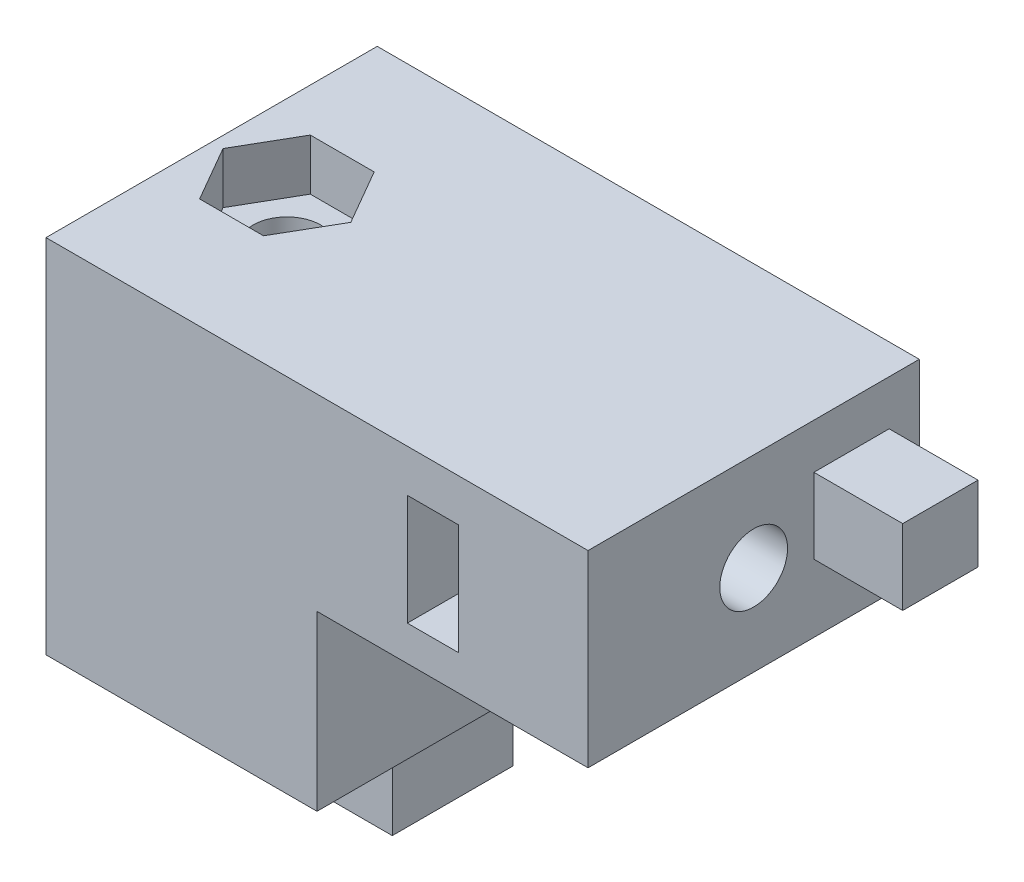
ISO-10303-21;
HEADER;
FILE_DESCRIPTION(('STEP AP214'),'2;1');
FILE_NAME('part.step','',(''),(''),'','','');
FILE_SCHEMA(('AUTOMOTIVE_DESIGN { 1 0 10303 214 1 1 1 1 }'));
ENDSEC;
DATA;
#1=APPLICATION_CONTEXT('core data for automotive mechanical design processes');
#2=APPLICATION_PROTOCOL_DEFINITION('international standard','automotive_design',2000,#1);
#3=PRODUCT_CONTEXT('',#1,'mechanical');
#4=PRODUCT('Part','Part','',(#3));
#5=PRODUCT_RELATED_PRODUCT_CATEGORY('part','',(#4));
#6=PRODUCT_DEFINITION_FORMATION('','',#4);
#7=PRODUCT_DEFINITION_CONTEXT('part definition',#1,'design');
#8=PRODUCT_DEFINITION('design','',#6,#7);
#9=PRODUCT_DEFINITION_SHAPE('','',#8);
#10=(LENGTH_UNIT() NAMED_UNIT(*) SI_UNIT(.MILLI.,.METRE.));
#11=(NAMED_UNIT(*) PLANE_ANGLE_UNIT() SI_UNIT($,.RADIAN.));
#12=(NAMED_UNIT(*) SI_UNIT($,.STERADIAN.) SOLID_ANGLE_UNIT());
#13=UNCERTAINTY_MEASURE_WITH_UNIT(LENGTH_MEASURE(1.E-05),#10,'distance_accuracy_value','');
#14=(GEOMETRIC_REPRESENTATION_CONTEXT(3) GLOBAL_UNCERTAINTY_ASSIGNED_CONTEXT((#13)) GLOBAL_UNIT_ASSIGNED_CONTEXT((#10,
#11,#12)) REPRESENTATION_CONTEXT('',''));
#15=CARTESIAN_POINT('',(0.,0.,0.));
#16=DIRECTION('',(0.,0.,1.));
#17=DIRECTION('',(1.,0.,0.));
#18=AXIS2_PLACEMENT_3D('',#15,#16,#17);
#19=CARTESIAN_POINT('',(0.,17.5,11.));
#20=DIRECTION('',(1.,0.,0.));
#21=DIRECTION('',(0.,0.,-1.));
#22=AXIS2_PLACEMENT_3D('',#19,#20,#21);
#23=CYLINDRICAL_SURFACE('',#22,2.25);
#24=CARTESIAN_POINT('',(23.9999999999924,17.5,11.));
#25=DIRECTION('',(-1.,0.,0.));
#26=DIRECTION('',(0.,0.,1.));
#27=AXIS2_PLACEMENT_3D('',#24,#25,#26);
#28=CIRCLE('',#27,2.25);
#29=CARTESIAN_POINT('',(23.9999999999924,17.5,13.25));
#30=VERTEX_POINT('',#29);
#31=EDGE_CURVE('E240',#30,#30,#28,.F.);
#32=ORIENTED_EDGE('',*,*,#31,.T.);
#33=EDGE_LOOP('',(#32));
#34=FACE_BOUND('',#33,.T.);
#35=CARTESIAN_POINT('',(5.,17.5,11.));
#36=DIRECTION('',(-0.707106781186547,0.707106781186547,0.));
#37=DIRECTION('',(0.707106781186547,0.707106781186547,0.));
#38=AXIS2_PLACEMENT_3D('',#35,#36,#37);
#39=ELLIPSE('',#38,3.18198051533946,2.25);
#40=CARTESIAN_POINT('',(5.,17.5,8.75));
#41=VERTEX_POINT('',#40);
#42=CARTESIAN_POINT('',(5.,17.5,13.25));
#43=VERTEX_POINT('',#42);
#44=EDGE_CURVE('E412',#41,#43,#39,.F.);
#45=ORIENTED_EDGE('',*,*,#44,.F.);
#46=CARTESIAN_POINT('',(5.,17.5,11.));
#47=DIRECTION('',(0.707106781186547,0.707106781186547,0.));
#48=DIRECTION('',(-0.707106781186547,0.707106781186547,0.));
#49=AXIS2_PLACEMENT_3D('',#46,#47,#48);
#50=ELLIPSE('',#49,3.18198051533946,2.25);
#51=EDGE_CURVE('E417',#43,#41,#50,.T.);
#52=ORIENTED_EDGE('',*,*,#51,.F.);
#53=EDGE_LOOP('',(#45,#52));
#54=FACE_BOUND('',#53,.T.);
#55=ADVANCED_FACE('F43',(#34,#54),#23,.F.);
#56=CARTESIAN_POINT('',(5.,-5.9,11.));
#57=DIRECTION('',(0.,1.,0.));
#58=DIRECTION('',(0.,0.,1.));
#59=AXIS2_PLACEMENT_3D('',#56,#57,#58);
#60=CYLINDRICAL_SURFACE('',#59,2.25);
#61=CARTESIAN_POINT('',(5.,20.6,11.));
#62=DIRECTION('',(0.,-1.,0.));
#63=DIRECTION('',(0.,0.,-1.));
#64=AXIS2_PLACEMENT_3D('',#61,#62,#63);
#65=CIRCLE('',#64,2.25);
#66=CARTESIAN_POINT('',(5.,20.6,8.75));
#67=VERTEX_POINT('',#66);
#68=EDGE_CURVE('E282',#67,#67,#65,.F.);
#69=ORIENTED_EDGE('',*,*,#68,.T.);
#70=EDGE_LOOP('',(#69));
#71=FACE_BOUND('',#70,.T.);
#72=ORIENTED_EDGE('',*,*,#44,.T.);
#73=CARTESIAN_POINT('',(5.,17.5,11.));
#74=DIRECTION('',(0.707106781186547,0.707106781186547,0.));
#75=DIRECTION('',(-0.707106781186547,0.707106781186547,0.));
#76=AXIS2_PLACEMENT_3D('',#73,#74,#75);
#77=ELLIPSE('',#76,3.18198051533946,2.25);
#78=EDGE_CURVE('E420',#43,#41,#77,.F.);
#79=ORIENTED_EDGE('',*,*,#78,.T.);
#80=EDGE_LOOP('',(#72,#79));
#81=FACE_BOUND('',#80,.T.);
#82=ADVANCED_FACE('F449',(#71,#81),#60,.F.);
#83=CARTESIAN_POINT('',(35.9999999999924,11.5,22.));
#84=DIRECTION('',(-1.,0.,0.));
#85=DIRECTION('',(0.,0.,1.));
#86=AXIS2_PLACEMENT_3D('',#83,#84,#85);
#87=PLANE('',#86);
#88=CARTESIAN_POINT('',(35.9999999999924,17.5,11.));
#89=DIRECTION('',(-1.,0.,0.));
#90=DIRECTION('',(0.,0.,1.));
#91=AXIS2_PLACEMENT_3D('',#88,#89,#90);
#92=CIRCLE('',#91,2.25);
#93=CARTESIAN_POINT('',(35.9999999999924,17.5,13.25));
#94=VERTEX_POINT('',#93);
#95=EDGE_CURVE('E296',#94,#94,#92,.T.);
#96=ORIENTED_EDGE('',*,*,#95,.T.);
#97=EDGE_LOOP('',(#96));
#98=FACE_BOUND('',#97,.T.);
#99=DIRECTION('',(0.,1.,0.));
#100=VECTOR('',#99,1.);
#101=CARTESIAN_POINT('',(35.9999999999924,11.5,0.));
#102=LINE('',#101,#100);
#103=CARTESIAN_POINT('',(35.9999999999924,11.5,0.));
#104=VERTEX_POINT('',#103);
#105=CARTESIAN_POINT('',(35.9999999999924,24.,0.));
#106=VERTEX_POINT('',#105);
#107=EDGE_CURVE('E392',#104,#106,#102,.T.);
#108=ORIENTED_EDGE('',*,*,#107,.T.);
#109=DIRECTION('',(0.,0.,-1.));
#110=VECTOR('',#109,1.);
#111=CARTESIAN_POINT('',(35.9999999999924,24.,22.));
#112=LINE('',#111,#110);
#113=CARTESIAN_POINT('',(35.9999999999924,24.,22.));
#114=VERTEX_POINT('',#113);
#115=EDGE_CURVE('E397',#114,#106,#112,.T.);
#116=ORIENTED_EDGE('',*,*,#115,.F.);
#117=DIRECTION('',(0.,1.,0.));
#118=VECTOR('',#117,1.);
#119=CARTESIAN_POINT('',(35.9999999999924,11.5,22.));
#120=LINE('',#119,#118);
#121=CARTESIAN_POINT('',(35.9999999999924,11.5,22.));
#122=VERTEX_POINT('',#121);
#123=EDGE_CURVE('E379',#122,#114,#120,.T.);
#124=ORIENTED_EDGE('',*,*,#123,.F.);
#125=DIRECTION('',(0.,0.,-1.));
#126=VECTOR('',#125,1.);
#127=CARTESIAN_POINT('',(35.9999999999924,11.5,22.));
#128=LINE('',#127,#126);
#129=EDGE_CURVE('E400',#122,#104,#128,.T.);
#130=ORIENTED_EDGE('',*,*,#129,.T.);
#131=EDGE_LOOP('',(#108,#116,#124,#130));
#132=FACE_BOUND('',#131,.T.);
#133=DIRECTION('',(0.,0.,-1.));
#134=VECTOR('',#133,1.);
#135=CARTESIAN_POINT('',(35.9999999999924,16.,7.));
#136=LINE('',#135,#134);
#137=CARTESIAN_POINT('',(35.9999999999924,16.,7.));
#138=VERTEX_POINT('',#137);
#139=CARTESIAN_POINT('',(35.9999999999924,16.,2.));
#140=VERTEX_POINT('',#139);
#141=EDGE_CURVE('E302',#138,#140,#136,.T.);
#142=ORIENTED_EDGE('',*,*,#141,.F.);
#143=DIRECTION('',(0.,-1.,0.));
#144=VECTOR('',#143,1.);
#145=CARTESIAN_POINT('',(35.9999999999924,21.,7.));
#146=LINE('',#145,#144);
#147=CARTESIAN_POINT('',(35.9999999999924,21.,7.));
#148=VERTEX_POINT('',#147);
#149=EDGE_CURVE('E307',#148,#138,#146,.T.);
#150=ORIENTED_EDGE('',*,*,#149,.F.);
#151=DIRECTION('',(0.,0.,1.));
#152=VECTOR('',#151,1.);
#153=CARTESIAN_POINT('',(35.9999999999924,21.,2.));
#154=LINE('',#153,#152);
#155=CARTESIAN_POINT('',(35.9999999999924,21.,2.));
#156=VERTEX_POINT('',#155);
#157=EDGE_CURVE('E319',#156,#148,#154,.T.);
#158=ORIENTED_EDGE('',*,*,#157,.F.);
#159=DIRECTION('',(0.,1.,0.));
#160=VECTOR('',#159,1.);
#161=CARTESIAN_POINT('',(35.9999999999924,16.,2.));
#162=LINE('',#161,#160);
#163=EDGE_CURVE('E316',#140,#156,#162,.T.);
#164=ORIENTED_EDGE('',*,*,#163,.F.);
#165=EDGE_LOOP('',(#142,#150,#158,#164));
#166=FACE_BOUND('',#165,.T.);
#167=ADVANCED_FACE('F458',(#98,#132,#166),#87,.F.);
#168=CARTESIAN_POINT('',(0.,24.,22.));
#169=DIRECTION('',(1.,0.,0.));
#170=DIRECTION('',(0.,0.,-1.));
#171=AXIS2_PLACEMENT_3D('',#168,#169,#170);
#172=PLANE('',#171);
#173=CARTESIAN_POINT('',(0.,17.5,11.));
#174=DIRECTION('',(1.,0.,0.));
#175=DIRECTION('',(0.,0.,-1.));
#176=AXIS2_PLACEMENT_3D('',#173,#174,#175);
#177=CIRCLE('',#176,2.25);
#178=CARTESIAN_POINT('',(0.,17.5,8.75));
#179=VERTEX_POINT('',#178);
#180=EDGE_CURVE('E293',#179,#179,#177,.T.);
#181=ORIENTED_EDGE('',*,*,#180,.T.);
#182=EDGE_LOOP('',(#181));
#183=FACE_BOUND('',#182,.T.);
#184=DIRECTION('',(0.,-1.,0.));
#185=VECTOR('',#184,1.);
#186=CARTESIAN_POINT('',(0.,24.,0.));
#187=LINE('',#186,#185);
#188=CARTESIAN_POINT('',(0.,24.,0.));
#189=VERTEX_POINT('',#188);
#190=CARTESIAN_POINT('',(0.,0.,0.));
#191=VERTEX_POINT('',#190);
#192=EDGE_CURVE('E363',#189,#191,#187,.T.);
#193=ORIENTED_EDGE('',*,*,#192,.T.);
#194=DIRECTION('',(0.,0.,-1.));
#195=VECTOR('',#194,1.);
#196=CARTESIAN_POINT('',(0.,0.,22.));
#197=LINE('',#196,#195);
#198=CARTESIAN_POINT('',(0.,0.,22.));
#199=VERTEX_POINT('',#198);
#200=EDGE_CURVE('E409',#199,#191,#197,.T.);
#201=ORIENTED_EDGE('',*,*,#200,.F.);
#202=DIRECTION('',(0.,-1.,0.));
#203=VECTOR('',#202,1.);
#204=CARTESIAN_POINT('',(0.,24.,22.));
#205=LINE('',#204,#203);
#206=CARTESIAN_POINT('',(0.,24.,22.));
#207=VERTEX_POINT('',#206);
#208=EDGE_CURVE('E369',#207,#199,#205,.T.);
#209=ORIENTED_EDGE('',*,*,#208,.F.);
#210=DIRECTION('',(0.,0.,-1.));
#211=VECTOR('',#210,1.);
#212=CARTESIAN_POINT('',(0.,24.,22.));
#213=LINE('',#212,#211);
#214=EDGE_CURVE('E383',#207,#189,#213,.T.);
#215=ORIENTED_EDGE('',*,*,#214,.T.);
#216=EDGE_LOOP('',(#193,#201,#209,#215));
#217=FACE_BOUND('',#216,.T.);
#218=ADVANCED_FACE('F45',(#183,#217),#172,.F.);
#219=CARTESIAN_POINT('',(0.,0.,22.));
#220=DIRECTION('',(0.,1.,0.));
#221=DIRECTION('',(0.,0.,1.));
#222=AXIS2_PLACEMENT_3D('',#219,#220,#221);
#223=PLANE('',#222);
#224=CARTESIAN_POINT('',(5.,0.,11.));
#225=DIRECTION('',(0.,1.,0.));
#226=DIRECTION('',(0.,0.,1.));
#227=AXIS2_PLACEMENT_3D('',#224,#225,#226);
#228=CIRCLE('',#227,2.25);
#229=CARTESIAN_POINT('',(5.,0.,13.25));
#230=VERTEX_POINT('',#229);
#231=EDGE_CURVE('E299',#230,#230,#228,.T.);
#232=ORIENTED_EDGE('',*,*,#231,.T.);
#233=EDGE_LOOP('',(#232));
#234=FACE_BOUND('',#233,.T.);
#235=DIRECTION('',(-1.,0.,0.));
#236=VECTOR('',#235,1.);
#237=CARTESIAN_POINT('',(10.,0.,7.));
#238=LINE('',#237,#236);
#239=CARTESIAN_POINT('',(16.,0.,7.));
#240=VERTEX_POINT('',#239);
#241=CARTESIAN_POINT('',(10.,0.,7.));
#242=VERTEX_POINT('',#241);
#243=EDGE_CURVE('E340',#240,#242,#238,.T.);
#244=ORIENTED_EDGE('',*,*,#243,.T.);
#245=DIRECTION('',(0.,0.,1.));
#246=VECTOR('',#245,1.);
#247=CARTESIAN_POINT('',(10.,0.,15.));
#248=LINE('',#247,#246);
#249=CARTESIAN_POINT('',(10.,0.,15.));
#250=VERTEX_POINT('',#249);
#251=EDGE_CURVE('E335',#242,#250,#248,.T.);
#252=ORIENTED_EDGE('',*,*,#251,.T.);
#253=DIRECTION('',(1.,0.,0.));
#254=VECTOR('',#253,1.);
#255=CARTESIAN_POINT('',(16.,0.,15.));
#256=LINE('',#255,#254);
#257=CARTESIAN_POINT('',(16.,0.,15.));
#258=VERTEX_POINT('',#257);
#259=EDGE_CURVE('E352',#250,#258,#256,.T.);
#260=ORIENTED_EDGE('',*,*,#259,.T.);
#261=DIRECTION('',(0.,0.,-1.));
#262=VECTOR('',#261,1.);
#263=CARTESIAN_POINT('',(16.,0.,7.));
#264=LINE('',#263,#262);
#265=EDGE_CURVE('E355',#258,#240,#264,.T.);
#266=ORIENTED_EDGE('',*,*,#265,.T.);
#267=EDGE_LOOP('',(#244,#252,#260,#266));
#268=FACE_BOUND('',#267,.T.);
#269=DIRECTION('',(1.,0.,0.));
#270=VECTOR('',#269,1.);
#271=CARTESIAN_POINT('',(0.,0.,0.));
#272=LINE('',#271,#270);
#273=CARTESIAN_POINT('',(18.,0.,0.));
#274=VERTEX_POINT('',#273);
#275=EDGE_CURVE('E386',#191,#274,#272,.T.);
#276=ORIENTED_EDGE('',*,*,#275,.T.);
#277=DIRECTION('',(0.,0.,-1.));
#278=VECTOR('',#277,1.);
#279=CARTESIAN_POINT('',(18.,0.,22.));
#280=LINE('',#279,#278);
#281=CARTESIAN_POINT('',(18.,0.,22.));
#282=VERTEX_POINT('',#281);
#283=EDGE_CURVE('E406',#282,#274,#280,.T.);
#284=ORIENTED_EDGE('',*,*,#283,.F.);
#285=DIRECTION('',(1.,0.,0.));
#286=VECTOR('',#285,1.);
#287=CARTESIAN_POINT('',(0.,0.,22.));
#288=LINE('',#287,#286);
#289=EDGE_CURVE('E372',#199,#282,#288,.T.);
#290=ORIENTED_EDGE('',*,*,#289,.F.);
#291=ORIENTED_EDGE('',*,*,#200,.T.);
#292=EDGE_LOOP('',(#276,#284,#290,#291));
#293=FACE_BOUND('',#292,.T.);
#294=ADVANCED_FACE('F542',(#234,#268,#293),#223,.F.);
#295=CARTESIAN_POINT('',(18.,0.,22.));
#296=DIRECTION('',(-1.,0.,0.));
#297=DIRECTION('',(0.,0.,1.));
#298=AXIS2_PLACEMENT_3D('',#295,#296,#297);
#299=PLANE('',#298);
#300=DIRECTION('',(0.,1.,0.));
#301=VECTOR('',#300,1.);
#302=CARTESIAN_POINT('',(18.,0.,0.));
#303=LINE('',#302,#301);
#304=CARTESIAN_POINT('',(18.,11.5,0.));
#305=VERTEX_POINT('',#304);
#306=EDGE_CURVE('E388',#274,#305,#303,.T.);
#307=ORIENTED_EDGE('',*,*,#306,.T.);
#308=DIRECTION('',(0.,0.,-1.));
#309=VECTOR('',#308,1.);
#310=CARTESIAN_POINT('',(18.,11.5,22.));
#311=LINE('',#310,#309);
#312=CARTESIAN_POINT('',(18.,11.5,22.));
#313=VERTEX_POINT('',#312);
#314=EDGE_CURVE('E403',#313,#305,#311,.T.);
#315=ORIENTED_EDGE('',*,*,#314,.F.);
#316=DIRECTION('',(0.,1.,0.));
#317=VECTOR('',#316,1.);
#318=CARTESIAN_POINT('',(18.,0.,22.));
#319=LINE('',#318,#317);
#320=EDGE_CURVE('E375',#282,#313,#319,.T.);
#321=ORIENTED_EDGE('',*,*,#320,.F.);
#322=ORIENTED_EDGE('',*,*,#283,.T.);
#323=EDGE_LOOP('',(#307,#315,#321,#322));
#324=FACE_BOUND('',#323,.T.);
#325=ADVANCED_FACE('F539',(#324),#299,.F.);
#326=CARTESIAN_POINT('',(18.,11.5,22.));
#327=DIRECTION('',(0.,1.,0.));
#328=DIRECTION('',(0.,0.,1.));
#329=AXIS2_PLACEMENT_3D('',#326,#327,#328);
#330=PLANE('',#329);
#331=DIRECTION('',(1.,0.,0.));
#332=VECTOR('',#331,1.);
#333=CARTESIAN_POINT('',(18.,11.5,0.));
#334=LINE('',#333,#332);
#335=EDGE_CURVE('E390',#305,#104,#334,.T.);
#336=ORIENTED_EDGE('',*,*,#335,.T.);
#337=ORIENTED_EDGE('',*,*,#129,.F.);
#338=DIRECTION('',(1.,0.,0.));
#339=VECTOR('',#338,1.);
#340=CARTESIAN_POINT('',(18.,11.5,22.));
#341=LINE('',#340,#339);
#342=EDGE_CURVE('E377',#313,#122,#341,.T.);
#343=ORIENTED_EDGE('',*,*,#342,.F.);
#344=ORIENTED_EDGE('',*,*,#314,.T.);
#345=EDGE_LOOP('',(#336,#337,#343,#344));
#346=FACE_BOUND('',#345,.T.);
#347=ADVANCED_FACE('F534',(#346),#330,.F.);
#348=CARTESIAN_POINT('',(35.9999999999924,24.,22.));
#349=DIRECTION('',(0.,-1.,0.));
#350=DIRECTION('',(0.,0.,-1.));
#351=AXIS2_PLACEMENT_3D('',#348,#349,#350);
#352=PLANE('',#351);
#353=DIRECTION('',(-1.,0.,0.));
#354=VECTOR('',#353,1.);
#355=CARTESIAN_POINT('',(2.87823776072812,24.,7.325));
#356=LINE('',#355,#354);
#357=CARTESIAN_POINT('',(7.12176223927187,24.,7.325));
#358=VERTEX_POINT('',#357);
#359=CARTESIAN_POINT('',(2.87823776072812,24.,7.325));
#360=VERTEX_POINT('',#359);
#361=EDGE_CURVE('E266',#358,#360,#356,.T.);
#362=ORIENTED_EDGE('',*,*,#361,.F.);
#363=DIRECTION('',(-0.5,0.,-0.866025403784439));
#364=VECTOR('',#363,1.);
#365=CARTESIAN_POINT('',(7.12176223927187,24.,7.325));
#366=LINE('',#365,#364);
#367=CARTESIAN_POINT('',(9.24352447854375,24.,11.));
#368=VERTEX_POINT('',#367);
#369=EDGE_CURVE('E244',#368,#358,#366,.T.);
#370=ORIENTED_EDGE('',*,*,#369,.F.);
#371=DIRECTION('',(0.5,0.,-0.866025403784439));
#372=VECTOR('',#371,1.);
#373=CARTESIAN_POINT('',(9.24352447854375,24.,11.));
#374=LINE('',#373,#372);
#375=CARTESIAN_POINT('',(7.12176223927187,24.,14.675));
#376=VERTEX_POINT('',#375);
#377=EDGE_CURVE('E249',#376,#368,#374,.T.);
#378=ORIENTED_EDGE('',*,*,#377,.F.);
#379=DIRECTION('',(1.,0.,0.));
#380=VECTOR('',#379,1.);
#381=CARTESIAN_POINT('',(7.12176223927187,24.,14.675));
#382=LINE('',#381,#380);
#383=CARTESIAN_POINT('',(2.87823776072813,24.,14.675));
#384=VERTEX_POINT('',#383);
#385=EDGE_CURVE('E275',#384,#376,#382,.T.);
#386=ORIENTED_EDGE('',*,*,#385,.F.);
#387=DIRECTION('',(0.5,0.,0.866025403784439));
#388=VECTOR('',#387,1.);
#389=CARTESIAN_POINT('',(2.87823776072813,24.,14.675));
#390=LINE('',#389,#388);
#391=CARTESIAN_POINT('',(0.756475521456251,24.,11.));
#392=VERTEX_POINT('',#391);
#393=EDGE_CURVE('E272',#392,#384,#390,.T.);
#394=ORIENTED_EDGE('',*,*,#393,.F.);
#395=DIRECTION('',(-0.5,0.,0.866025403784439));
#396=VECTOR('',#395,1.);
#397=CARTESIAN_POINT('',(0.756475521456251,24.,11.));
#398=LINE('',#397,#396);
#399=EDGE_CURVE('E269',#360,#392,#398,.T.);
#400=ORIENTED_EDGE('',*,*,#399,.F.);
#401=EDGE_LOOP('',(#362,#370,#378,#386,#394,#400));
#402=FACE_BOUND('',#401,.T.);
#403=DIRECTION('',(-1.,0.,0.));
#404=VECTOR('',#403,1.);
#405=CARTESIAN_POINT('',(35.9999999999924,24.,0.));
#406=LINE('',#405,#404);
#407=EDGE_CURVE('E373',#106,#189,#406,.T.);
#408=ORIENTED_EDGE('',*,*,#407,.T.);
#409=ORIENTED_EDGE('',*,*,#214,.F.);
#410=DIRECTION('',(-1.,0.,0.));
#411=VECTOR('',#410,1.);
#412=CARTESIAN_POINT('',(35.9999999999924,24.,22.));
#413=LINE('',#412,#411);
#414=EDGE_CURVE('E381',#114,#207,#413,.T.);
#415=ORIENTED_EDGE('',*,*,#414,.F.);
#416=ORIENTED_EDGE('',*,*,#115,.T.);
#417=EDGE_LOOP('',(#408,#409,#415,#416));
#418=FACE_BOUND('',#417,.T.);
#419=ADVANCED_FACE('F531',(#402,#418),#352,.F.);
#420=CARTESIAN_POINT('',(0.,0.,22.));
#421=DIRECTION('',(0.,0.,1.));
#422=DIRECTION('',(1.,0.,0.));
#423=AXIS2_PLACEMENT_3D('',#420,#421,#422);
#424=PLANE('',#423);
#425=DIRECTION('',(0.,-1.,0.));
#426=VECTOR('',#425,1.);
#427=CARTESIAN_POINT('',(23.9999999999924,21.175,22.));
#428=LINE('',#427,#426);
#429=CARTESIAN_POINT('',(23.9999999999924,21.175,22.));
#430=VERTEX_POINT('',#429);
#431=CARTESIAN_POINT('',(23.9999999999924,13.825,22.));
#432=VERTEX_POINT('',#431);
#433=EDGE_CURVE('E58',#430,#432,#428,.T.);
#434=ORIENTED_EDGE('',*,*,#433,.F.);
#435=DIRECTION('',(-1.,0.,0.));
#436=VECTOR('',#435,1.);
#437=CARTESIAN_POINT('',(27.3999999999924,21.175,22.));
#438=LINE('',#437,#436);
#439=CARTESIAN_POINT('',(27.3999999999924,21.175,22.));
#440=VERTEX_POINT('',#439);
#441=EDGE_CURVE('E229',#440,#430,#438,.T.);
#442=ORIENTED_EDGE('',*,*,#441,.F.);
#443=DIRECTION('',(0.,1.,0.));
#444=VECTOR('',#443,1.);
#445=CARTESIAN_POINT('',(27.3999999999924,13.825,22.));
#446=LINE('',#445,#444);
#447=CARTESIAN_POINT('',(27.3999999999924,13.825,22.));
#448=VERTEX_POINT('',#447);
#449=EDGE_CURVE('E213',#448,#440,#446,.T.);
#450=ORIENTED_EDGE('',*,*,#449,.F.);
#451=DIRECTION('',(1.,0.,0.));
#452=VECTOR('',#451,1.);
#453=CARTESIAN_POINT('',(23.9999999999924,13.825,22.));
#454=LINE('',#453,#452);
#455=EDGE_CURVE('E222',#432,#448,#454,.T.);
#456=ORIENTED_EDGE('',*,*,#455,.F.);
#457=EDGE_LOOP('',(#434,#442,#450,#456));
#458=FACE_BOUND('',#457,.T.);
#459=ORIENTED_EDGE('',*,*,#208,.T.);
#460=ORIENTED_EDGE('',*,*,#289,.T.);
#461=ORIENTED_EDGE('',*,*,#320,.T.);
#462=ORIENTED_EDGE('',*,*,#342,.T.);
#463=ORIENTED_EDGE('',*,*,#123,.T.);
#464=ORIENTED_EDGE('',*,*,#414,.T.);
#465=EDGE_LOOP('',(#459,#460,#461,#462,#463,#464));
#466=FACE_BOUND('',#465,.T.);
#467=ADVANCED_FACE('F226',(#458,#466),#424,.T.);
#468=CARTESIAN_POINT('',(0.,0.,0.));
#469=DIRECTION('',(0.,0.,1.));
#470=DIRECTION('',(1.,0.,0.));
#471=AXIS2_PLACEMENT_3D('',#468,#469,#470);
#472=PLANE('',#471);
#473=DIRECTION('',(-1.,0.,0.));
#474=VECTOR('',#473,1.);
#475=CARTESIAN_POINT('',(0.,21.175,0.));
#476=LINE('',#475,#474);
#477=CARTESIAN_POINT('',(27.3999999999924,21.175,0.));
#478=VERTEX_POINT('',#477);
#479=CARTESIAN_POINT('',(23.9999999999924,21.175,0.));
#480=VERTEX_POINT('',#479);
#481=EDGE_CURVE('E11',#478,#480,#476,.T.);
#482=ORIENTED_EDGE('',*,*,#481,.T.);
#483=DIRECTION('',(0.,-1.,0.));
#484=VECTOR('',#483,1.);
#485=CARTESIAN_POINT('',(23.9999999999924,0.,0.));
#486=LINE('',#485,#484);
#487=CARTESIAN_POINT('',(23.9999999999924,13.825,0.));
#488=VERTEX_POINT('',#487);
#489=EDGE_CURVE('E241',#480,#488,#486,.T.);
#490=ORIENTED_EDGE('',*,*,#489,.T.);
#491=DIRECTION('',(1.,0.,0.));
#492=VECTOR('',#491,1.);
#493=CARTESIAN_POINT('',(0.,13.825,0.));
#494=LINE('',#493,#492);
#495=CARTESIAN_POINT('',(27.3999999999924,13.825,0.));
#496=VERTEX_POINT('',#495);
#497=EDGE_CURVE('E51',#488,#496,#494,.T.);
#498=ORIENTED_EDGE('',*,*,#497,.T.);
#499=DIRECTION('',(0.,1.,0.));
#500=VECTOR('',#499,1.);
#501=CARTESIAN_POINT('',(27.3999999999924,0.,0.));
#502=LINE('',#501,#500);
#503=EDGE_CURVE('E216',#496,#478,#502,.T.);
#504=ORIENTED_EDGE('',*,*,#503,.T.);
#505=EDGE_LOOP('',(#482,#490,#498,#504));
#506=FACE_BOUND('',#505,.T.);
#507=ORIENTED_EDGE('',*,*,#192,.F.);
#508=ORIENTED_EDGE('',*,*,#407,.F.);
#509=ORIENTED_EDGE('',*,*,#107,.F.);
#510=ORIENTED_EDGE('',*,*,#335,.F.);
#511=ORIENTED_EDGE('',*,*,#306,.F.);
#512=ORIENTED_EDGE('',*,*,#275,.F.);
#513=EDGE_LOOP('',(#507,#508,#509,#510,#511,#512));
#514=FACE_BOUND('',#513,.T.);
#515=ADVANCED_FACE('F429',(#506,#514),#472,.F.);
#516=CARTESIAN_POINT('',(10.,-5.9,15.));
#517=DIRECTION('',(-1.,0.,0.));
#518=DIRECTION('',(0.,0.,1.));
#519=AXIS2_PLACEMENT_3D('',#516,#517,#518);
#520=PLANE('',#519);
#521=ORIENTED_EDGE('',*,*,#251,.F.);
#522=DIRECTION('',(0.,1.,0.));
#523=VECTOR('',#522,1.);
#524=CARTESIAN_POINT('',(10.,-5.9,7.));
#525=LINE('',#524,#523);
#526=CARTESIAN_POINT('',(10.,-5.9,7.));
#527=VERTEX_POINT('',#526);
#528=EDGE_CURVE('E360',#527,#242,#525,.T.);
#529=ORIENTED_EDGE('',*,*,#528,.F.);
#530=DIRECTION('',(0.,0.,1.));
#531=VECTOR('',#530,1.);
#532=CARTESIAN_POINT('',(10.,-5.9,15.));
#533=LINE('',#532,#531);
#534=CARTESIAN_POINT('',(10.,-5.9,15.));
#535=VERTEX_POINT('',#534);
#536=EDGE_CURVE('E336',#527,#535,#533,.T.);
#537=ORIENTED_EDGE('',*,*,#536,.T.);
#538=DIRECTION('',(0.,1.,0.));
#539=VECTOR('',#538,1.);
#540=CARTESIAN_POINT('',(10.,-5.9,15.));
#541=LINE('',#540,#539);
#542=EDGE_CURVE('E349',#535,#250,#541,.T.);
#543=ORIENTED_EDGE('',*,*,#542,.T.);
#544=EDGE_LOOP('',(#521,#529,#537,#543));
#545=FACE_BOUND('',#544,.T.);
#546=ADVANCED_FACE('F519',(#545),#520,.T.);
#547=CARTESIAN_POINT('',(10.,-5.9,7.));
#548=DIRECTION('',(0.,0.,-1.));
#549=DIRECTION('',(-1.,0.,0.));
#550=AXIS2_PLACEMENT_3D('',#547,#548,#549);
#551=PLANE('',#550);
#552=ORIENTED_EDGE('',*,*,#243,.F.);
#553=DIRECTION('',(0.,1.,0.));
#554=VECTOR('',#553,1.);
#555=CARTESIAN_POINT('',(16.,-5.9,7.));
#556=LINE('',#555,#554);
#557=CARTESIAN_POINT('',(16.,-5.9,7.));
#558=VERTEX_POINT('',#557);
#559=EDGE_CURVE('E364',#558,#240,#556,.T.);
#560=ORIENTED_EDGE('',*,*,#559,.F.);
#561=DIRECTION('',(-1.,0.,0.));
#562=VECTOR('',#561,1.);
#563=CARTESIAN_POINT('',(10.,-5.9,7.));
#564=LINE('',#563,#562);
#565=EDGE_CURVE('E346',#558,#527,#564,.T.);
#566=ORIENTED_EDGE('',*,*,#565,.T.);
#567=ORIENTED_EDGE('',*,*,#528,.T.);
#568=EDGE_LOOP('',(#552,#560,#566,#567));
#569=FACE_BOUND('',#568,.T.);
#570=ADVANCED_FACE('F515',(#569),#551,.T.);
#571=CARTESIAN_POINT('',(16.,-5.9,7.));
#572=DIRECTION('',(1.,0.,0.));
#573=DIRECTION('',(0.,0.,-1.));
#574=AXIS2_PLACEMENT_3D('',#571,#572,#573);
#575=PLANE('',#574);
#576=ORIENTED_EDGE('',*,*,#265,.F.);
#577=DIRECTION('',(0.,1.,0.));
#578=VECTOR('',#577,1.);
#579=CARTESIAN_POINT('',(16.,-5.9,15.));
#580=LINE('',#579,#578);
#581=CARTESIAN_POINT('',(16.,-5.9,15.));
#582=VERTEX_POINT('',#581);
#583=EDGE_CURVE('E366',#582,#258,#580,.T.);
#584=ORIENTED_EDGE('',*,*,#583,.F.);
#585=DIRECTION('',(0.,0.,-1.));
#586=VECTOR('',#585,1.);
#587=CARTESIAN_POINT('',(16.,-5.9,7.));
#588=LINE('',#587,#586);
#589=EDGE_CURVE('E343',#582,#558,#588,.T.);
#590=ORIENTED_EDGE('',*,*,#589,.T.);
#591=ORIENTED_EDGE('',*,*,#559,.T.);
#592=EDGE_LOOP('',(#576,#584,#590,#591));
#593=FACE_BOUND('',#592,.T.);
#594=ADVANCED_FACE('F518',(#593),#575,.T.);
#595=CARTESIAN_POINT('',(16.,-5.9,15.));
#596=DIRECTION('',(0.,0.,1.));
#597=DIRECTION('',(1.,0.,0.));
#598=AXIS2_PLACEMENT_3D('',#595,#596,#597);
#599=PLANE('',#598);
#600=ORIENTED_EDGE('',*,*,#259,.F.);
#601=ORIENTED_EDGE('',*,*,#542,.F.);
#602=DIRECTION('',(1.,0.,0.));
#603=VECTOR('',#602,1.);
#604=CARTESIAN_POINT('',(16.,-5.9,15.));
#605=LINE('',#604,#603);
#606=EDGE_CURVE('E339',#535,#582,#605,.T.);
#607=ORIENTED_EDGE('',*,*,#606,.T.);
#608=ORIENTED_EDGE('',*,*,#583,.T.);
#609=EDGE_LOOP('',(#600,#601,#607,#608));
#610=FACE_BOUND('',#609,.T.);
#611=ADVANCED_FACE('F513',(#610),#599,.T.);
#612=CARTESIAN_POINT('',(0.,-5.9,0.));
#613=DIRECTION('',(0.,-1.,0.));
#614=DIRECTION('',(0.,0.,-1.));
#615=AXIS2_PLACEMENT_3D('',#612,#613,#614);
#616=PLANE('',#615);
#617=ORIENTED_EDGE('',*,*,#536,.F.);
#618=ORIENTED_EDGE('',*,*,#565,.F.);
#619=ORIENTED_EDGE('',*,*,#589,.F.);
#620=ORIENTED_EDGE('',*,*,#606,.F.);
#621=EDGE_LOOP('',(#617,#618,#619,#620));
#622=FACE_BOUND('',#621,.T.);
#623=ADVANCED_FACE('F507',(#622),#616,.T.);
#624=CARTESIAN_POINT('',(41.8999999999924,16.,7.));
#625=DIRECTION('',(0.,1.,0.));
#626=DIRECTION('',(0.,0.,1.));
#627=AXIS2_PLACEMENT_3D('',#624,#625,#626);
#628=PLANE('',#627);
#629=ORIENTED_EDGE('',*,*,#141,.T.);
#630=DIRECTION('',(-1.,0.,0.));
#631=VECTOR('',#630,1.);
#632=CARTESIAN_POINT('',(41.8999999999924,16.,2.));
#633=LINE('',#632,#631);
#634=CARTESIAN_POINT('',(41.8999999999924,16.,2.));
#635=VERTEX_POINT('',#634);
#636=EDGE_CURVE('E332',#635,#140,#633,.T.);
#637=ORIENTED_EDGE('',*,*,#636,.F.);
#638=DIRECTION('',(0.,0.,-1.));
#639=VECTOR('',#638,1.);
#640=CARTESIAN_POINT('',(41.8999999999924,16.,7.));
#641=LINE('',#640,#639);
#642=CARTESIAN_POINT('',(41.8999999999924,16.,7.));
#643=VERTEX_POINT('',#642);
#644=EDGE_CURVE('E303',#643,#635,#641,.T.);
#645=ORIENTED_EDGE('',*,*,#644,.F.);
#646=DIRECTION('',(-1.,0.,0.));
#647=VECTOR('',#646,1.);
#648=CARTESIAN_POINT('',(41.8999999999924,16.,7.));
#649=LINE('',#648,#647);
#650=EDGE_CURVE('E313',#643,#138,#649,.T.);
#651=ORIENTED_EDGE('',*,*,#650,.T.);
#652=EDGE_LOOP('',(#629,#637,#645,#651));
#653=FACE_BOUND('',#652,.T.);
#654=ADVANCED_FACE('F492',(#653),#628,.F.);
#655=CARTESIAN_POINT('',(41.8999999999924,16.,2.));
#656=DIRECTION('',(0.,0.,1.));
#657=DIRECTION('',(1.,0.,0.));
#658=AXIS2_PLACEMENT_3D('',#655,#656,#657);
#659=PLANE('',#658);
#660=ORIENTED_EDGE('',*,*,#163,.T.);
#661=DIRECTION('',(-1.,0.,0.));
#662=VECTOR('',#661,1.);
#663=CARTESIAN_POINT('',(41.8999999999924,21.,2.));
#664=LINE('',#663,#662);
#665=CARTESIAN_POINT('',(41.8999999999924,21.,2.));
#666=VERTEX_POINT('',#665);
#667=EDGE_CURVE('E329',#666,#156,#664,.T.);
#668=ORIENTED_EDGE('',*,*,#667,.F.);
#669=DIRECTION('',(0.,1.,0.));
#670=VECTOR('',#669,1.);
#671=CARTESIAN_POINT('',(41.8999999999924,16.,2.));
#672=LINE('',#671,#670);
#673=EDGE_CURVE('E306',#635,#666,#672,.T.);
#674=ORIENTED_EDGE('',*,*,#673,.F.);
#675=ORIENTED_EDGE('',*,*,#636,.T.);
#676=EDGE_LOOP('',(#660,#668,#674,#675));
#677=FACE_BOUND('',#676,.T.);
#678=ADVANCED_FACE('F499',(#677),#659,.F.);
#679=CARTESIAN_POINT('',(41.8999999999924,21.,2.));
#680=DIRECTION('',(0.,-1.,0.));
#681=DIRECTION('',(0.,0.,-1.));
#682=AXIS2_PLACEMENT_3D('',#679,#680,#681);
#683=PLANE('',#682);
#684=ORIENTED_EDGE('',*,*,#157,.T.);
#685=DIRECTION('',(-1.,0.,0.));
#686=VECTOR('',#685,1.);
#687=CARTESIAN_POINT('',(41.8999999999924,21.,7.));
#688=LINE('',#687,#686);
#689=CARTESIAN_POINT('',(41.8999999999924,21.,7.));
#690=VERTEX_POINT('',#689);
#691=EDGE_CURVE('E326',#690,#148,#688,.T.);
#692=ORIENTED_EDGE('',*,*,#691,.F.);
#693=DIRECTION('',(0.,0.,1.));
#694=VECTOR('',#693,1.);
#695=CARTESIAN_POINT('',(41.8999999999924,21.,2.));
#696=LINE('',#695,#694);
#697=EDGE_CURVE('E309',#666,#690,#696,.T.);
#698=ORIENTED_EDGE('',*,*,#697,.F.);
#699=ORIENTED_EDGE('',*,*,#667,.T.);
#700=EDGE_LOOP('',(#684,#692,#698,#699));
#701=FACE_BOUND('',#700,.T.);
#702=ADVANCED_FACE('F497',(#701),#683,.F.);
#703=CARTESIAN_POINT('',(41.8999999999924,21.,7.));
#704=DIRECTION('',(0.,0.,-1.));
#705=DIRECTION('',(-1.,0.,0.));
#706=AXIS2_PLACEMENT_3D('',#703,#704,#705);
#707=PLANE('',#706);
#708=ORIENTED_EDGE('',*,*,#149,.T.);
#709=ORIENTED_EDGE('',*,*,#650,.F.);
#710=DIRECTION('',(0.,-1.,0.));
#711=VECTOR('',#710,1.);
#712=CARTESIAN_POINT('',(41.8999999999924,21.,7.));
#713=LINE('',#712,#711);
#714=EDGE_CURVE('E311',#690,#643,#713,.T.);
#715=ORIENTED_EDGE('',*,*,#714,.F.);
#716=ORIENTED_EDGE('',*,*,#691,.T.);
#717=EDGE_LOOP('',(#708,#709,#715,#716));
#718=FACE_BOUND('',#717,.T.);
#719=ADVANCED_FACE('F488',(#718),#707,.F.);
#720=CARTESIAN_POINT('',(41.8999999999924,0.,0.));
#721=DIRECTION('',(1.,0.,0.));
#722=DIRECTION('',(0.,0.,-1.));
#723=AXIS2_PLACEMENT_3D('',#720,#721,#722);
#724=PLANE('',#723);
#725=ORIENTED_EDGE('',*,*,#644,.T.);
#726=ORIENTED_EDGE('',*,*,#673,.T.);
#727=ORIENTED_EDGE('',*,*,#697,.T.);
#728=ORIENTED_EDGE('',*,*,#714,.T.);
#729=EDGE_LOOP('',(#725,#726,#727,#728));
#730=FACE_BOUND('',#729,.T.);
#731=ADVANCED_FACE('F472',(#730),#724,.T.);
#732=CARTESIAN_POINT('',(5.,17.5,11.));
#733=DIRECTION('',(-0.707106781186547,0.707106781186547,0.));
#734=DIRECTION('',(0.707106781186547,0.707106781186547,0.));
#735=AXIS2_PLACEMENT_3D('',#732,#733,#734);
#736=ELLIPSE('',#735,3.18198051533946,2.25);
#737=EDGE_CURVE('E414',#41,#43,#736,.T.);
#738=ORIENTED_EDGE('',*,*,#737,.T.);
#739=ORIENTED_EDGE('',*,*,#51,.T.);
#740=EDGE_LOOP('',(#738,#739));
#741=FACE_BOUND('',#740,.T.);
#742=ORIENTED_EDGE('',*,*,#231,.F.);
#743=EDGE_LOOP('',(#742));
#744=FACE_BOUND('',#743,.T.);
#745=ADVANCED_FACE('F461',(#741,#744),#60,.F.);
#746=CARTESIAN_POINT('',(27.3999999999924,17.5,11.));
#747=DIRECTION('',(1.,0.,0.));
#748=DIRECTION('',(0.,0.,-1.));
#749=AXIS2_PLACEMENT_3D('',#746,#747,#748);
#750=CIRCLE('',#749,2.25);
#751=CARTESIAN_POINT('',(27.3999999999924,17.5,8.75));
#752=VERTEX_POINT('',#751);
#753=EDGE_CURVE('E236',#752,#752,#750,.F.);
#754=ORIENTED_EDGE('',*,*,#753,.T.);
#755=EDGE_LOOP('',(#754));
#756=FACE_BOUND('',#755,.T.);
#757=ORIENTED_EDGE('',*,*,#95,.F.);
#758=EDGE_LOOP('',(#757));
#759=FACE_BOUND('',#758,.T.);
#760=ADVANCED_FACE('F453',(#756,#759),#23,.F.);
#761=ORIENTED_EDGE('',*,*,#180,.F.);
#762=EDGE_LOOP('',(#761));
#763=FACE_BOUND('',#762,.T.);
#764=ORIENTED_EDGE('',*,*,#737,.F.);
#765=ORIENTED_EDGE('',*,*,#78,.F.);
#766=EDGE_LOOP('',(#764,#765));
#767=FACE_BOUND('',#766,.T.);
#768=ADVANCED_FACE('F452',(#763,#767),#23,.F.);
#769=CARTESIAN_POINT('',(0.,20.6,0.));
#770=DIRECTION('',(0.,-1.,0.));
#771=DIRECTION('',(0.,0.,-1.));
#772=AXIS2_PLACEMENT_3D('',#769,#770,#771);
#773=PLANE('',#772);
#774=DIRECTION('',(-0.5,0.,-0.866025403784439));
#775=VECTOR('',#774,1.);
#776=CARTESIAN_POINT('',(7.12176223927187,20.6,7.325));
#777=LINE('',#776,#775);
#778=CARTESIAN_POINT('',(9.24352447854375,20.6,11.));
#779=VERTEX_POINT('',#778);
#780=CARTESIAN_POINT('',(7.12176223927187,20.6,7.325));
#781=VERTEX_POINT('',#780);
#782=EDGE_CURVE('E245',#779,#781,#777,.T.);
#783=ORIENTED_EDGE('',*,*,#782,.T.);
#784=DIRECTION('',(-1.,0.,0.));
#785=VECTOR('',#784,1.);
#786=CARTESIAN_POINT('',(2.87823776072812,20.6,7.325));
#787=LINE('',#786,#785);
#788=CARTESIAN_POINT('',(2.87823776072812,20.6,7.325));
#789=VERTEX_POINT('',#788);
#790=EDGE_CURVE('E248',#781,#789,#787,.T.);
#791=ORIENTED_EDGE('',*,*,#790,.T.);
#792=DIRECTION('',(-0.5,0.,0.866025403784439));
#793=VECTOR('',#792,1.);
#794=CARTESIAN_POINT('',(0.756475521456251,20.6,11.));
#795=LINE('',#794,#793);
#796=CARTESIAN_POINT('',(0.756475521456251,20.6,11.));
#797=VERTEX_POINT('',#796);
#798=EDGE_CURVE('E252',#789,#797,#795,.T.);
#799=ORIENTED_EDGE('',*,*,#798,.T.);
#800=DIRECTION('',(0.5,0.,0.866025403784439));
#801=VECTOR('',#800,1.);
#802=CARTESIAN_POINT('',(2.87823776072813,20.6,14.675));
#803=LINE('',#802,#801);
#804=CARTESIAN_POINT('',(2.87823776072813,20.6,14.675));
#805=VERTEX_POINT('',#804);
#806=EDGE_CURVE('E255',#797,#805,#803,.T.);
#807=ORIENTED_EDGE('',*,*,#806,.T.);
#808=DIRECTION('',(1.,0.,0.));
#809=VECTOR('',#808,1.);
#810=CARTESIAN_POINT('',(7.12176223927187,20.6,14.675));
#811=LINE('',#810,#809);
#812=CARTESIAN_POINT('',(7.12176223927187,20.6,14.675));
#813=VERTEX_POINT('',#812);
#814=EDGE_CURVE('E258',#805,#813,#811,.T.);
#815=ORIENTED_EDGE('',*,*,#814,.T.);
#816=DIRECTION('',(0.5,0.,-0.866025403784439));
#817=VECTOR('',#816,1.);
#818=CARTESIAN_POINT('',(9.24352447854375,20.6,11.));
#819=LINE('',#818,#817);
#820=EDGE_CURVE('E261',#813,#779,#819,.T.);
#821=ORIENTED_EDGE('',*,*,#820,.T.);
#822=EDGE_LOOP('',(#783,#791,#799,#807,#815,#821));
#823=FACE_BOUND('',#822,.T.);
#824=ORIENTED_EDGE('',*,*,#68,.F.);
#825=EDGE_LOOP('',(#824));
#826=FACE_BOUND('',#825,.T.);
#827=ADVANCED_FACE('F465',(#823,#826),#773,.F.);
#828=CARTESIAN_POINT('',(7.12176223927187,20.6,7.325));
#829=DIRECTION('',(0.866025403784439,0.,-0.5));
#830=DIRECTION('',(-0.5,0.,-0.866025403784439));
#831=AXIS2_PLACEMENT_3D('',#828,#829,#830);
#832=PLANE('',#831);
#833=ORIENTED_EDGE('',*,*,#369,.T.);
#834=DIRECTION('',(0.,1.,0.));
#835=VECTOR('',#834,1.);
#836=CARTESIAN_POINT('',(7.12176223927187,20.6,7.325));
#837=LINE('',#836,#835);
#838=EDGE_CURVE('E264',#781,#358,#837,.T.);
#839=ORIENTED_EDGE('',*,*,#838,.F.);
#840=ORIENTED_EDGE('',*,*,#782,.F.);
#841=DIRECTION('',(0.,1.,0.));
#842=VECTOR('',#841,1.);
#843=CARTESIAN_POINT('',(9.24352447854375,20.6,11.));
#844=LINE('',#843,#842);
#845=EDGE_CURVE('E280',#779,#368,#844,.T.);
#846=ORIENTED_EDGE('',*,*,#845,.T.);
#847=EDGE_LOOP('',(#833,#839,#840,#846));
#848=FACE_BOUND('',#847,.T.);
#849=ADVANCED_FACE('F618',(#848),#832,.F.);
#850=CARTESIAN_POINT('',(9.24352447854375,20.6,11.));
#851=DIRECTION('',(0.866025403784439,0.,0.5));
#852=DIRECTION('',(0.5,0.,-0.866025403784439));
#853=AXIS2_PLACEMENT_3D('',#850,#851,#852);
#854=PLANE('',#853);
#855=ORIENTED_EDGE('',*,*,#377,.T.);
#856=ORIENTED_EDGE('',*,*,#845,.F.);
#857=ORIENTED_EDGE('',*,*,#820,.F.);
#858=DIRECTION('',(0.,1.,0.));
#859=VECTOR('',#858,1.);
#860=CARTESIAN_POINT('',(7.12176223927187,20.6,14.675));
#861=LINE('',#860,#859);
#862=EDGE_CURVE('E283',#813,#376,#861,.T.);
#863=ORIENTED_EDGE('',*,*,#862,.T.);
#864=EDGE_LOOP('',(#855,#856,#857,#863));
#865=FACE_BOUND('',#864,.T.);
#866=ADVANCED_FACE('F627',(#865),#854,.F.);
#867=CARTESIAN_POINT('',(7.12176223927187,20.6,14.675));
#868=DIRECTION('',(0.,0.,1.));
#869=DIRECTION('',(1.,0.,0.));
#870=AXIS2_PLACEMENT_3D('',#867,#868,#869);
#871=PLANE('',#870);
#872=ORIENTED_EDGE('',*,*,#385,.T.);
#873=ORIENTED_EDGE('',*,*,#862,.F.);
#874=ORIENTED_EDGE('',*,*,#814,.F.);
#875=DIRECTION('',(0.,1.,0.));
#876=VECTOR('',#875,1.);
#877=CARTESIAN_POINT('',(2.87823776072813,20.6,14.675));
#878=LINE('',#877,#876);
#879=EDGE_CURVE('E285',#805,#384,#878,.T.);
#880=ORIENTED_EDGE('',*,*,#879,.T.);
#881=EDGE_LOOP('',(#872,#873,#874,#880));
#882=FACE_BOUND('',#881,.T.);
#883=ADVANCED_FACE('F635',(#882),#871,.F.);
#884=CARTESIAN_POINT('',(2.87823776072813,20.6,14.675));
#885=DIRECTION('',(-0.866025403784439,0.,0.5));
#886=DIRECTION('',(0.5,0.,0.866025403784439));
#887=AXIS2_PLACEMENT_3D('',#884,#885,#886);
#888=PLANE('',#887);
#889=ORIENTED_EDGE('',*,*,#393,.T.);
#890=ORIENTED_EDGE('',*,*,#879,.F.);
#891=ORIENTED_EDGE('',*,*,#806,.F.);
#892=DIRECTION('',(0.,1.,0.));
#893=VECTOR('',#892,1.);
#894=CARTESIAN_POINT('',(0.756475521456251,20.6,11.));
#895=LINE('',#894,#893);
#896=EDGE_CURVE('E287',#797,#392,#895,.T.);
#897=ORIENTED_EDGE('',*,*,#896,.T.);
#898=EDGE_LOOP('',(#889,#890,#891,#897));
#899=FACE_BOUND('',#898,.T.);
#900=ADVANCED_FACE('F644',(#899),#888,.F.);
#901=CARTESIAN_POINT('',(0.756475521456251,20.6,11.));
#902=DIRECTION('',(-0.866025403784439,0.,-0.5));
#903=DIRECTION('',(-0.5,0.,0.866025403784439));
#904=AXIS2_PLACEMENT_3D('',#901,#902,#903);
#905=PLANE('',#904);
#906=ORIENTED_EDGE('',*,*,#399,.T.);
#907=ORIENTED_EDGE('',*,*,#896,.F.);
#908=ORIENTED_EDGE('',*,*,#798,.F.);
#909=DIRECTION('',(0.,1.,0.));
#910=VECTOR('',#909,1.);
#911=CARTESIAN_POINT('',(2.87823776072812,20.6,7.325));
#912=LINE('',#911,#910);
#913=EDGE_CURVE('E289',#789,#360,#912,.T.);
#914=ORIENTED_EDGE('',*,*,#913,.T.);
#915=EDGE_LOOP('',(#906,#907,#908,#914));
#916=FACE_BOUND('',#915,.T.);
#917=ADVANCED_FACE('F444',(#916),#905,.F.);
#918=CARTESIAN_POINT('',(2.87823776072812,20.6,7.325));
#919=DIRECTION('',(0.,0.,-1.));
#920=DIRECTION('',(-1.,0.,0.));
#921=AXIS2_PLACEMENT_3D('',#918,#919,#920);
#922=PLANE('',#921);
#923=ORIENTED_EDGE('',*,*,#361,.T.);
#924=ORIENTED_EDGE('',*,*,#913,.F.);
#925=ORIENTED_EDGE('',*,*,#790,.F.);
#926=ORIENTED_EDGE('',*,*,#838,.T.);
#927=EDGE_LOOP('',(#923,#924,#925,#926));
#928=FACE_BOUND('',#927,.T.);
#929=ADVANCED_FACE('F436',(#928),#922,.F.);
#930=CARTESIAN_POINT('',(27.3999999999924,21.175,-1.2E-05));
#931=DIRECTION('',(0.,1.,0.));
#932=DIRECTION('',(0.,0.,1.));
#933=AXIS2_PLACEMENT_3D('',#930,#931,#932);
#934=PLANE('',#933);
#935=DIRECTION('',(0.,0.,1.));
#936=VECTOR('',#935,1.);
#937=CARTESIAN_POINT('',(27.3999999999924,21.175,-1.2E-05));
#938=LINE('',#937,#936);
#939=EDGE_CURVE('E218',#478,#440,#938,.T.);
#940=ORIENTED_EDGE('',*,*,#939,.T.);
#941=ORIENTED_EDGE('',*,*,#441,.T.);
#942=DIRECTION('',(0.,0.,1.));
#943=VECTOR('',#942,1.);
#944=CARTESIAN_POINT('',(23.9999999999924,21.175,-1.2E-05));
#945=LINE('',#944,#943);
#946=EDGE_CURVE('E234',#480,#430,#945,.T.);
#947=ORIENTED_EDGE('',*,*,#946,.F.);
#948=ORIENTED_EDGE('',*,*,#481,.F.);
#949=EDGE_LOOP('',(#940,#941,#947,#948));
#950=FACE_BOUND('',#949,.T.);
#951=ADVANCED_FACE('F434',(#950),#934,.F.);
#952=CARTESIAN_POINT('',(23.9999999999924,13.825,-1.2E-05));
#953=DIRECTION('',(0.,-1.,0.));
#954=DIRECTION('',(0.,0.,-1.));
#955=AXIS2_PLACEMENT_3D('',#952,#953,#954);
#956=PLANE('',#955);
#957=DIRECTION('',(0.,0.,1.));
#958=VECTOR('',#957,1.);
#959=CARTESIAN_POINT('',(23.9999999999924,13.825,-1.2E-05));
#960=LINE('',#959,#958);
#961=EDGE_CURVE('E219',#488,#432,#960,.T.);
#962=ORIENTED_EDGE('',*,*,#961,.T.);
#963=ORIENTED_EDGE('',*,*,#455,.T.);
#964=DIRECTION('',(0.,0.,1.));
#965=VECTOR('',#964,1.);
#966=CARTESIAN_POINT('',(27.3999999999924,13.825,-1.2E-05));
#967=LINE('',#966,#965);
#968=EDGE_CURVE('E66',#496,#448,#967,.T.);
#969=ORIENTED_EDGE('',*,*,#968,.F.);
#970=ORIENTED_EDGE('',*,*,#497,.F.);
#971=EDGE_LOOP('',(#962,#963,#969,#970));
#972=FACE_BOUND('',#971,.T.);
#973=ADVANCED_FACE('F223',(#972),#956,.F.);
#974=CARTESIAN_POINT('',(23.9999999999924,21.175,-1.2E-05));
#975=DIRECTION('',(-1.,0.,0.));
#976=DIRECTION('',(0.,0.,1.));
#977=AXIS2_PLACEMENT_3D('',#974,#975,#976);
#978=PLANE('',#977);
#979=ORIENTED_EDGE('',*,*,#31,.F.);
#980=EDGE_LOOP('',(#979));
#981=FACE_BOUND('',#980,.T.);
#982=ORIENTED_EDGE('',*,*,#946,.T.);
#983=ORIENTED_EDGE('',*,*,#433,.T.);
#984=ORIENTED_EDGE('',*,*,#961,.F.);
#985=ORIENTED_EDGE('',*,*,#489,.F.);
#986=EDGE_LOOP('',(#982,#983,#984,#985));
#987=FACE_BOUND('',#986,.T.);
#988=ADVANCED_FACE('F431',(#981,#987),#978,.F.);
#989=CARTESIAN_POINT('',(27.3999999999924,13.825,-1.2E-05));
#990=DIRECTION('',(1.,0.,0.));
#991=DIRECTION('',(0.,0.,-1.));
#992=AXIS2_PLACEMENT_3D('',#989,#990,#991);
#993=PLANE('',#992);
#994=ORIENTED_EDGE('',*,*,#753,.F.);
#995=EDGE_LOOP('',(#994));
#996=FACE_BOUND('',#995,.T.);
#997=ORIENTED_EDGE('',*,*,#968,.T.);
#998=ORIENTED_EDGE('',*,*,#449,.T.);
#999=ORIENTED_EDGE('',*,*,#939,.F.);
#1000=ORIENTED_EDGE('',*,*,#503,.F.);
#1001=EDGE_LOOP('',(#997,#998,#999,#1000));
#1002=FACE_BOUND('',#1001,.T.);
#1003=ADVANCED_FACE('F210',(#996,#1002),#993,.F.);
#1004=CLOSED_SHELL('',(#55,#82,#167,#218,#294,#325,#347,#419,#467,#515,#546,#570,#594,#611,#623,
#654,#678,#702,#719,#731,#745,#760,#768,#827,#849,#866,#883,#900,#917,#929,#951,#973,#988,#1003));
#1005=MANIFOLD_SOLID_BREP('B2',#1004);
#1006=ADVANCED_BREP_SHAPE_REPRESENTATION('',(#18,#1005),#14);
#1007=SHAPE_DEFINITION_REPRESENTATION(#9,#1006);
ENDSEC;
END-ISO-10303-21;
